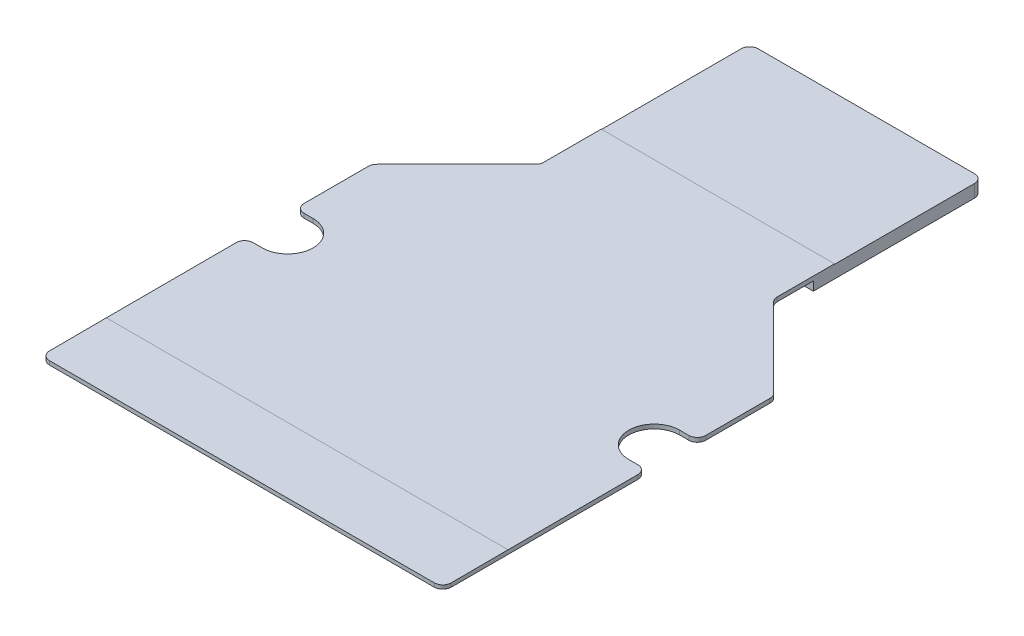
ISO-10303-21;
HEADER;
FILE_DESCRIPTION(('STEP AP214'),'2;1');
FILE_NAME('part.step','',(''),(''),'','','');
FILE_SCHEMA(('AUTOMOTIVE_DESIGN { 1 0 10303 214 1 1 1 1 }'));
ENDSEC;
DATA;
#1=APPLICATION_CONTEXT('core data for automotive mechanical design processes');
#2=APPLICATION_PROTOCOL_DEFINITION('international standard','automotive_design',2000,#1);
#3=PRODUCT_CONTEXT('',#1,'mechanical');
#4=PRODUCT('Part','Part','',(#3));
#5=PRODUCT_RELATED_PRODUCT_CATEGORY('part','',(#4));
#6=PRODUCT_DEFINITION_FORMATION('','',#4);
#7=PRODUCT_DEFINITION_CONTEXT('part definition',#1,'design');
#8=PRODUCT_DEFINITION('design','',#6,#7);
#9=PRODUCT_DEFINITION_SHAPE('','',#8);
#10=(LENGTH_UNIT() NAMED_UNIT(*) SI_UNIT(.MILLI.,.METRE.));
#11=(NAMED_UNIT(*) PLANE_ANGLE_UNIT() SI_UNIT($,.RADIAN.));
#12=(NAMED_UNIT(*) SI_UNIT($,.STERADIAN.) SOLID_ANGLE_UNIT());
#13=UNCERTAINTY_MEASURE_WITH_UNIT(LENGTH_MEASURE(1.E-05),#10,'distance_accuracy_value','');
#14=(GEOMETRIC_REPRESENTATION_CONTEXT(3) GLOBAL_UNCERTAINTY_ASSIGNED_CONTEXT((#13)) GLOBAL_UNIT_ASSIGNED_CONTEXT((#10,
#11,#12)) REPRESENTATION_CONTEXT('',''));
#15=CARTESIAN_POINT('',(0.,0.,0.));
#16=DIRECTION('',(0.,0.,1.));
#17=DIRECTION('',(1.,0.,0.));
#18=AXIS2_PLACEMENT_3D('',#15,#16,#17);
#19=CARTESIAN_POINT('',(-3.3,0.09,-3.51));
#20=DIRECTION('',(0.,-1.,0.));
#21=DIRECTION('',(0.,0.,-1.));
#22=AXIS2_PLACEMENT_3D('',#19,#20,#21);
#23=PLANE('',#22);
#24=CARTESIAN_POINT('',(-2.55,0.0900000000001455,-7.16));
#25=DIRECTION('',(0.,-1.,0.));
#26=DIRECTION('',(-1.,0.,0.));
#27=AXIS2_PLACEMENT_3D('',#24,#25,#26);
#28=CIRCLE('',#27,0.2);
#29=CARTESIAN_POINT('',(-2.75,0.0900000000000364,-7.16));
#30=VERTEX_POINT('',#29);
#31=CARTESIAN_POINT('',(-2.55,0.0900000000000728,-7.36));
#32=VERTEX_POINT('',#31);
#33=EDGE_CURVE('E668',#30,#32,#28,.T.);
#34=ORIENTED_EDGE('',*,*,#33,.F.);
#35=DIRECTION('',(0.,0.,1.));
#36=VECTOR('',#35,1.);
#37=CARTESIAN_POINT('',(-2.75,0.09,-7.62521572875));
#38=LINE('',#37,#36);
#39=CARTESIAN_POINT('',(-2.75,0.09,-3.86));
#40=VERTEX_POINT('',#39);
#41=EDGE_CURVE('E505',#40,#30,#38,.F.);
#42=ORIENTED_EDGE('',*,*,#41,.F.);
#43=DIRECTION('',(1.,0.,0.));
#44=VECTOR('',#43,1.);
#45=CARTESIAN_POINT('',(-3.3,0.09,-3.86));
#46=LINE('',#45,#44);
#47=CARTESIAN_POINT('',(2.75,0.09,-3.86));
#48=VERTEX_POINT('',#47);
#49=EDGE_CURVE('E691',#40,#48,#46,.T.);
#50=ORIENTED_EDGE('',*,*,#49,.T.);
#51=DIRECTION('',(0.,0.,1.));
#52=VECTOR('',#51,1.);
#53=CARTESIAN_POINT('',(2.75,0.09,-7.62521572875));
#54=LINE('',#53,#52);
#55=CARTESIAN_POINT('',(2.75,0.0900000000000728,-7.16));
#56=VERTEX_POINT('',#55);
#57=EDGE_CURVE('E546',#48,#56,#54,.F.);
#58=ORIENTED_EDGE('',*,*,#57,.T.);
#59=CARTESIAN_POINT('',(2.55,0.0900000000001455,-7.16));
#60=DIRECTION('',(0.,-1.,0.));
#61=DIRECTION('',(0.,0.,-1.));
#62=AXIS2_PLACEMENT_3D('',#59,#60,#61);
#63=CIRCLE('',#62,0.2);
#64=CARTESIAN_POINT('',(2.55,0.0900000000000364,-7.36));
#65=VERTEX_POINT('',#64);
#66=EDGE_CURVE('E553',#65,#56,#63,.T.);
#67=ORIENTED_EDGE('',*,*,#66,.F.);
#68=DIRECTION('',(-1.,0.,0.));
#69=VECTOR('',#68,1.);
#70=CARTESIAN_POINT('',(3.06,0.09,-7.36));
#71=LINE('',#70,#69);
#72=EDGE_CURVE('E587',#32,#65,#71,.F.);
#73=ORIENTED_EDGE('',*,*,#72,.F.);
#74=EDGE_LOOP('',(#34,#42,#50,#58,#67,#73));
#75=FACE_BOUND('',#74,.T.);
#76=ADVANCED_FACE('F17',(#75),#23,.F.);
#77=CARTESIAN_POINT('',(2.75,-0.241000000005,-7.62521572875));
#78=DIRECTION('',(-1.,0.,0.));
#79=DIRECTION('',(0.,0.,1.));
#80=AXIS2_PLACEMENT_3D('',#77,#78,#79);
#81=PLANE('',#80);
#82=DIRECTION('',(0.,1.,0.));
#83=VECTOR('',#82,1.);
#84=CARTESIAN_POINT('',(2.75,201000.,-7.16));
#85=LINE('',#84,#83);
#86=CARTESIAN_POINT('',(2.75,-0.209999999990696,-7.16));
#87=VERTEX_POINT('',#86);
#88=EDGE_CURVE('E580',#56,#87,#85,.F.);
#89=ORIENTED_EDGE('',*,*,#88,.F.);
#90=ORIENTED_EDGE('',*,*,#57,.F.);
#91=DIRECTION('',(0.,1.,0.));
#92=VECTOR('',#91,1.);
#93=CARTESIAN_POINT('',(2.75,0.0889999999956,-3.86));
#94=LINE('',#93,#92);
#95=CARTESIAN_POINT('',(2.75,0.100000000003,-3.86));
#96=VERTEX_POINT('',#95);
#97=EDGE_CURVE('E509',#48,#96,#94,.T.);
#98=ORIENTED_EDGE('',*,*,#97,.T.);
#99=DIRECTION('',(0.,0.,1.));
#100=VECTOR('',#99,1.);
#101=CARTESIAN_POINT('',(2.75,0.100000000006,-7.62521572875));
#102=LINE('',#101,#100);
#103=CARTESIAN_POINT('',(2.75,0.10000000000466,-2.50784271247));
#104=VERTEX_POINT('',#103);
#105=EDGE_CURVE('E272',#104,#96,#102,.F.);
#106=ORIENTED_EDGE('',*,*,#105,.F.);
#107=DIRECTION('',(0.,1.,0.));
#108=VECTOR('',#107,1.);
#109=CARTESIAN_POINT('',(2.75,-0.241000000005,-2.50784271247));
#110=LINE('',#109,#108);
#111=CARTESIAN_POINT('',(2.75,0.,-2.50784271247));
#112=VERTEX_POINT('',#111);
#113=EDGE_CURVE('E270',#112,#104,#110,.T.);
#114=ORIENTED_EDGE('',*,*,#113,.F.);
#115=DIRECTION('',(0.,0.,1.));
#116=VECTOR('',#115,1.);
#117=CARTESIAN_POINT('',(2.75,0.,-7.62521572875));
#118=LINE('',#117,#116);
#119=CARTESIAN_POINT('',(2.75,0.,-3.36));
#120=VERTEX_POINT('',#119);
#121=EDGE_CURVE('E253',#120,#112,#118,.T.);
#122=ORIENTED_EDGE('',*,*,#121,.F.);
#123=DIRECTION('',(0.,1.,0.));
#124=VECTOR('',#123,1.);
#125=CARTESIAN_POINT('',(2.75,-0.241000000005,-3.36));
#126=LINE('',#125,#124);
#127=CARTESIAN_POINT('',(2.75,-0.21,-3.36));
#128=VERTEX_POINT('',#127);
#129=EDGE_CURVE('E243',#128,#120,#126,.T.);
#130=ORIENTED_EDGE('',*,*,#129,.F.);
#131=DIRECTION('',(0.,0.,1.));
#132=VECTOR('',#131,1.);
#133=CARTESIAN_POINT('',(2.75,-0.21,-7.76));
#134=LINE('',#133,#132);
#135=EDGE_CURVE('E440',#128,#87,#134,.F.);
#136=ORIENTED_EDGE('',*,*,#135,.T.);
#137=EDGE_LOOP('',(#89,#90,#98,#106,#114,#122,#130,#136));
#138=FACE_BOUND('',#137,.T.);
#139=ADVANCED_FACE('F268',(#138),#81,.F.);
#140=CARTESIAN_POINT('',(2.55,201000.,-7.16));
#141=DIRECTION('',(0.,1.,0.));
#142=DIRECTION('',(0.,0.,1.));
#143=AXIS2_PLACEMENT_3D('',#140,#141,#142);
#144=CYLINDRICAL_SURFACE('',#143,0.2);
#145=ORIENTED_EDGE('',*,*,#66,.T.);
#146=ORIENTED_EDGE('',*,*,#88,.T.);
#147=CARTESIAN_POINT('',(2.55,-0.209999999981392,-7.16));
#148=DIRECTION('',(0.,1.,0.));
#149=DIRECTION('',(1.,0.,0.));
#150=AXIS2_PLACEMENT_3D('',#147,#148,#149);
#151=CIRCLE('',#150,0.2);
#152=CARTESIAN_POINT('',(2.55,-0.209999999993348,-7.36));
#153=VERTEX_POINT('',#152);
#154=EDGE_CURVE('E397',#87,#153,#151,.T.);
#155=ORIENTED_EDGE('',*,*,#154,.T.);
#156=DIRECTION('',(0.,1.,0.));
#157=VECTOR('',#156,1.);
#158=CARTESIAN_POINT('',(2.55,-0.240000000012,-7.36));
#159=LINE('',#158,#157);
#160=EDGE_CURVE('E708',#65,#153,#159,.F.);
#161=ORIENTED_EDGE('',*,*,#160,.F.);
#162=EDGE_LOOP('',(#145,#146,#155,#161));
#163=FACE_BOUND('',#162,.T.);
#164=ADVANCED_FACE('F565',(#163),#144,.T.);
#165=CARTESIAN_POINT('',(3.06,-0.240000000012,-7.36));
#166=DIRECTION('',(0.,0.,-1.));
#167=DIRECTION('',(-1.,0.,0.));
#168=AXIS2_PLACEMENT_3D('',#165,#166,#167);
#169=PLANE('',#168);
#170=ORIENTED_EDGE('',*,*,#72,.T.);
#171=ORIENTED_EDGE('',*,*,#160,.T.);
#172=DIRECTION('',(1.,0.,0.));
#173=VECTOR('',#172,1.);
#174=CARTESIAN_POINT('',(-3.3,-0.21,-7.36));
#175=LINE('',#174,#173);
#176=CARTESIAN_POINT('',(-2.55,-0.210000000000022,-7.36));
#177=VERTEX_POINT('',#176);
#178=EDGE_CURVE('E436',#153,#177,#175,.F.);
#179=ORIENTED_EDGE('',*,*,#178,.T.);
#180=DIRECTION('',(0.,-1.,0.));
#181=VECTOR('',#180,1.);
#182=CARTESIAN_POINT('',(-2.55,1000.,-7.36));
#183=LINE('',#182,#181);
#184=EDGE_CURVE('E523',#32,#177,#183,.T.);
#185=ORIENTED_EDGE('',*,*,#184,.F.);
#186=EDGE_LOOP('',(#170,#171,#179,#185));
#187=FACE_BOUND('',#186,.T.);
#188=ADVANCED_FACE('F536',(#187),#169,.T.);
#189=CARTESIAN_POINT('',(-2.55,1000.,-7.16));
#190=DIRECTION('',(0.,-1.,0.));
#191=DIRECTION('',(0.,0.,-1.));
#192=AXIS2_PLACEMENT_3D('',#189,#190,#191);
#193=CYLINDRICAL_SURFACE('',#192,0.2);
#194=ORIENTED_EDGE('',*,*,#33,.T.);
#195=ORIENTED_EDGE('',*,*,#184,.T.);
#196=CARTESIAN_POINT('',(-2.55,-0.210000000000043,-7.16));
#197=DIRECTION('',(0.,1.,0.));
#198=DIRECTION('',(0.,0.,-1.));
#199=AXIS2_PLACEMENT_3D('',#196,#197,#198);
#200=CIRCLE('',#199,0.2);
#201=CARTESIAN_POINT('',(-2.75,-0.210000000000011,-7.16));
#202=VERTEX_POINT('',#201);
#203=EDGE_CURVE('E433',#177,#202,#200,.T.);
#204=ORIENTED_EDGE('',*,*,#203,.T.);
#205=DIRECTION('',(0.,1.,0.));
#206=VECTOR('',#205,1.);
#207=CARTESIAN_POINT('',(-2.75,-0.241000000024,-7.16));
#208=LINE('',#207,#206);
#209=EDGE_CURVE('E496',#30,#202,#208,.F.);
#210=ORIENTED_EDGE('',*,*,#209,.F.);
#211=EDGE_LOOP('',(#194,#195,#204,#210));
#212=FACE_BOUND('',#211,.T.);
#213=ADVANCED_FACE('F525',(#212),#193,.T.);
#214=CARTESIAN_POINT('',(-2.75,-0.241000000024,-7.62521572875));
#215=DIRECTION('',(-1.,0.,0.));
#216=DIRECTION('',(0.,0.,1.));
#217=AXIS2_PLACEMENT_3D('',#214,#215,#216);
#218=PLANE('',#217);
#219=DIRECTION('',(0.,0.,1.));
#220=VECTOR('',#219,1.);
#221=CARTESIAN_POINT('',(-2.75,-0.21,-7.76));
#222=LINE('',#221,#220);
#223=CARTESIAN_POINT('',(-2.75,-0.21,-3.36));
#224=VERTEX_POINT('',#223);
#225=EDGE_CURVE('E424',#202,#224,#222,.T.);
#226=ORIENTED_EDGE('',*,*,#225,.T.);
#227=DIRECTION('',(0.,1.,0.));
#228=VECTOR('',#227,1.);
#229=CARTESIAN_POINT('',(-2.75,-0.241000000024,-3.36));
#230=LINE('',#229,#228);
#231=CARTESIAN_POINT('',(-2.75,0.,-3.36));
#232=VERTEX_POINT('',#231);
#233=EDGE_CURVE('E504',#224,#232,#230,.T.);
#234=ORIENTED_EDGE('',*,*,#233,.T.);
#235=DIRECTION('',(0.,0.,1.));
#236=VECTOR('',#235,1.);
#237=CARTESIAN_POINT('',(-2.75,0.,-7.62521572875));
#238=LINE('',#237,#236);
#239=CARTESIAN_POINT('',(-2.75,0.,-2.50784271247));
#240=VERTEX_POINT('',#239);
#241=EDGE_CURVE('E262',#232,#240,#238,.T.);
#242=ORIENTED_EDGE('',*,*,#241,.T.);
#243=DIRECTION('',(0.,1.,0.));
#244=VECTOR('',#243,1.);
#245=CARTESIAN_POINT('',(-2.75,-0.241000000024,-2.50784271247));
#246=LINE('',#245,#244);
#247=CARTESIAN_POINT('',(-2.75,0.0999999999999945,-2.50784271247));
#248=VERTEX_POINT('',#247);
#249=EDGE_CURVE('E680',#240,#248,#246,.T.);
#250=ORIENTED_EDGE('',*,*,#249,.T.);
#251=DIRECTION('',(0.,0.,1.));
#252=VECTOR('',#251,1.);
#253=CARTESIAN_POINT('',(-2.75,0.1,-7.62521572875));
#254=LINE('',#253,#252);
#255=CARTESIAN_POINT('',(-2.75,0.1,-3.86));
#256=VERTEX_POINT('',#255);
#257=EDGE_CURVE('E685',#248,#256,#254,.F.);
#258=ORIENTED_EDGE('',*,*,#257,.T.);
#259=DIRECTION('',(0.,1.,0.));
#260=VECTOR('',#259,1.);
#261=CARTESIAN_POINT('',(-2.75,0.0889999999956,-3.86));
#262=LINE('',#261,#260);
#263=EDGE_CURVE('E688',#256,#40,#262,.F.);
#264=ORIENTED_EDGE('',*,*,#263,.T.);
#265=ORIENTED_EDGE('',*,*,#41,.T.);
#266=ORIENTED_EDGE('',*,*,#209,.T.);
#267=EDGE_LOOP('',(#226,#234,#242,#250,#258,#264,#265,#266));
#268=FACE_BOUND('',#267,.T.);
#269=ADVANCED_FACE('F535',(#268),#218,.T.);
#270=CARTESIAN_POINT('',(-3.3,0.0889999999956,-3.86));
#271=DIRECTION('',(0.,0.,1.));
#272=DIRECTION('',(1.,0.,0.));
#273=AXIS2_PLACEMENT_3D('',#270,#271,#272);
#274=PLANE('',#273);
#275=ORIENTED_EDGE('',*,*,#263,.F.);
#276=DIRECTION('',(1.,0.,0.));
#277=VECTOR('',#276,1.);
#278=CARTESIAN_POINT('',(-5.682,0.1,-3.86));
#279=LINE('',#278,#277);
#280=EDGE_CURVE('E432',#256,#96,#279,.T.);
#281=ORIENTED_EDGE('',*,*,#280,.T.);
#282=ORIENTED_EDGE('',*,*,#97,.F.);
#283=ORIENTED_EDGE('',*,*,#49,.F.);
#284=EDGE_LOOP('',(#275,#281,#282,#283));
#285=FACE_BOUND('',#284,.T.);
#286=ADVANCED_FACE('F723',(#285),#274,.F.);
#287=CARTESIAN_POINT('',(-5.682,0.09,7.514));
#288=DIRECTION('',(0.,-1.,0.));
#289=DIRECTION('',(0.,0.,-1.));
#290=AXIS2_PLACEMENT_3D('',#287,#288,#289);
#291=PLANE('',#290);
#292=CARTESIAN_POINT('',(-4.535,0.0900000000000345,7.16));
#293=DIRECTION('',(0.,-1.,0.));
#294=DIRECTION('',(0.,0.,1.));
#295=AXIS2_PLACEMENT_3D('',#292,#293,#294);
#296=CIRCLE('',#295,0.2);
#297=CARTESIAN_POINT('',(-4.535,0.0900000000000172,7.36));
#298=VERTEX_POINT('',#297);
#299=CARTESIAN_POINT('',(-4.735,0.0900000000000086,7.16));
#300=VERTEX_POINT('',#299);
#301=EDGE_CURVE('E469',#298,#300,#296,.T.);
#302=ORIENTED_EDGE('',*,*,#301,.F.);
#303=DIRECTION('',(1.,0.,0.));
#304=VECTOR('',#303,1.);
#305=CARTESIAN_POINT('',(-5.442,0.09,7.36));
#306=LINE('',#305,#304);
#307=CARTESIAN_POINT('',(4.535,0.0900000000000172,7.36));
#308=VERTEX_POINT('',#307);
#309=EDGE_CURVE('E364',#308,#298,#306,.F.);
#310=ORIENTED_EDGE('',*,*,#309,.F.);
#311=CARTESIAN_POINT('',(4.535,0.0900000000000345,7.16));
#312=DIRECTION('',(0.,-1.,0.));
#313=DIRECTION('',(1.,0.,0.));
#314=AXIS2_PLACEMENT_3D('',#311,#312,#313);
#315=CIRCLE('',#314,0.2);
#316=CARTESIAN_POINT('',(4.735,0.0900000000000138,7.16));
#317=VERTEX_POINT('',#316);
#318=EDGE_CURVE('E459',#317,#308,#315,.T.);
#319=ORIENTED_EDGE('',*,*,#318,.F.);
#320=CARTESIAN_POINT('',(4.735,0.09,5.82));
#321=DIRECTION('',(0.,0.,1.));
#322=VECTOR('',#321,1.);
#323=LINE('',#320,#322);
#324=CARTESIAN_POINT('',(4.735,0.095,5.81999999999897));
#325=VERTEX_POINT('',#324);
#326=EDGE_CURVE('E639',#325,#317,#323,.T.);
#327=ORIENTED_EDGE('',*,*,#326,.F.);
#328=CARTESIAN_POINT('',(4.735,0.09,5.82));
#329=DIRECTION('',(-1.,0.,0.));
#330=VECTOR('',#329,1.);
#331=LINE('',#328,#330);
#332=CARTESIAN_POINT('',(-4.735,0.0950000000000325,5.81999999999005));
#333=VERTEX_POINT('',#332);
#334=EDGE_CURVE('E375',#325,#333,#331,.T.);
#335=ORIENTED_EDGE('',*,*,#334,.T.);
#336=DIRECTION('',(0.,0.,-1.));
#337=VECTOR('',#336,1.);
#338=CARTESIAN_POINT('',(-4.735,0.09,7.514));
#339=LINE('',#338,#337);
#340=EDGE_CURVE('E187',#300,#333,#339,.T.);
#341=ORIENTED_EDGE('',*,*,#340,.F.);
#342=EDGE_LOOP('',(#302,#310,#319,#327,#335,#341));
#343=FACE_BOUND('',#342,.T.);
#344=ADVANCED_FACE('F415',(#343),#291,.F.);
#345=CARTESIAN_POINT('',(-3.3,-0.21,-7.76));
#346=DIRECTION('',(0.,1.,0.));
#347=DIRECTION('',(0.,0.,1.));
#348=AXIS2_PLACEMENT_3D('',#345,#346,#347);
#349=PLANE('',#348);
#350=ORIENTED_EDGE('',*,*,#203,.F.);
#351=ORIENTED_EDGE('',*,*,#178,.F.);
#352=ORIENTED_EDGE('',*,*,#154,.F.);
#353=ORIENTED_EDGE('',*,*,#135,.F.);
#354=DIRECTION('',(1.,0.,0.));
#355=VECTOR('',#354,1.);
#356=CARTESIAN_POINT('',(-3.3,-0.21,-3.36));
#357=LINE('',#356,#355);
#358=EDGE_CURVE('E249',#224,#128,#357,.T.);
#359=ORIENTED_EDGE('',*,*,#358,.F.);
#360=ORIENTED_EDGE('',*,*,#225,.F.);
#361=EDGE_LOOP('',(#350,#351,#352,#353,#359,#360));
#362=FACE_BOUND('',#361,.T.);
#363=ADVANCED_FACE('F404',(#362),#349,.F.);
#364=CARTESIAN_POINT('',(-5.682,0.1,6.788));
#365=DIRECTION('',(0.,-1.,0.));
#366=DIRECTION('',(0.,0.,-1.));
#367=AXIS2_PLACEMENT_3D('',#364,#365,#366);
#368=PLANE('',#367);
#369=CARTESIAN_POINT('',(-4.535,0.099999999999989,2.76));
#370=DIRECTION('',(0.,1.,0.));
#371=DIRECTION('',(0.,0.,1.));
#372=AXIS2_PLACEMENT_3D('',#369,#370,#371);
#373=CIRCLE('',#372,0.2);
#374=CARTESIAN_POINT('',(-4.735,0.0999999999999917,2.76));
#375=VERTEX_POINT('',#374);
#376=CARTESIAN_POINT('',(-4.535,0.0999999999999945,2.56));
#377=VERTEX_POINT('',#376);
#378=EDGE_CURVE('E175',#375,#377,#373,.F.);
#379=ORIENTED_EDGE('',*,*,#378,.F.);
#380=DIRECTION('',(0.,0.,-1.));
#381=VECTOR('',#380,1.);
#382=CARTESIAN_POINT('',(-4.735,0.1,6.788));
#383=LINE('',#382,#381);
#384=EDGE_CURVE('E358',#333,#375,#383,.T.);
#385=ORIENTED_EDGE('',*,*,#384,.F.);
#386=ORIENTED_EDGE('',*,*,#334,.F.);
#387=DIRECTION('',(0.,0.,-1.));
#388=VECTOR('',#387,1.);
#389=CARTESIAN_POINT('',(4.735,0.1,7.6));
#390=LINE('',#389,#388);
#391=CARTESIAN_POINT('',(4.735,0.10000000000166,2.76));
#392=VERTEX_POINT('',#391);
#393=EDGE_CURVE('E378',#392,#325,#390,.F.);
#394=ORIENTED_EDGE('',*,*,#393,.F.);
#395=CARTESIAN_POINT('',(4.535,0.10000000000332,2.76));
#396=DIRECTION('',(0.,-1.,0.));
#397=DIRECTION('',(0.,0.,-1.));
#398=AXIS2_PLACEMENT_3D('',#395,#396,#397);
#399=CIRCLE('',#398,0.2);
#400=CARTESIAN_POINT('',(4.535,0.10000000000249,2.56));
#401=VERTEX_POINT('',#400);
#402=EDGE_CURVE('E319',#401,#392,#399,.T.);
#403=ORIENTED_EDGE('',*,*,#402,.F.);
#404=DIRECTION('',(1.,0.,0.));
#405=VECTOR('',#404,1.);
#406=CARTESIAN_POINT('',(4.2985,0.1,2.56));
#407=LINE('',#406,#405);
#408=CARTESIAN_POINT('',(4.32,0.10000000000166,2.56));
#409=VERTEX_POINT('',#408);
#410=EDGE_CURVE('E322',#401,#409,#407,.F.);
#411=ORIENTED_EDGE('',*,*,#410,.T.);
#412=CARTESIAN_POINT('',(4.32,0.10000000000332,1.96));
#413=DIRECTION('',(0.,-1.,0.));
#414=DIRECTION('',(0.,0.,-1.));
#415=AXIS2_PLACEMENT_3D('',#412,#413,#414);
#416=CIRCLE('',#415,0.6);
#417=CARTESIAN_POINT('',(4.32,0.10000000000249,1.36));
#418=VERTEX_POINT('',#417);
#419=EDGE_CURVE('E323',#409,#418,#416,.T.);
#420=ORIENTED_EDGE('',*,*,#419,.T.);
#421=DIRECTION('',(-1.,0.,0.));
#422=VECTOR('',#421,1.);
#423=CARTESIAN_POINT('',(4.5565,0.1,1.36));
#424=LINE('',#423,#422);
#425=CARTESIAN_POINT('',(4.535,0.10000000000166,1.36));
#426=VERTEX_POINT('',#425);
#427=EDGE_CURVE('E330',#418,#426,#424,.F.);
#428=ORIENTED_EDGE('',*,*,#427,.T.);
#429=CARTESIAN_POINT('',(4.535,0.10000000000332,1.16));
#430=DIRECTION('',(0.,1.,0.));
#431=DIRECTION('',(0.,0.,1.));
#432=AXIS2_PLACEMENT_3D('',#429,#430,#431);
#433=CIRCLE('',#432,0.2);
#434=CARTESIAN_POINT('',(4.735,0.10000000000249,1.16));
#435=VERTEX_POINT('',#434);
#436=EDGE_CURVE('E327',#435,#426,#433,.F.);
#437=ORIENTED_EDGE('',*,*,#436,.F.);
#438=DIRECTION('',(0.,0.,-1.));
#439=VECTOR('',#438,1.);
#440=CARTESIAN_POINT('',(4.735,0.1,1.31171572875));
#441=LINE('',#440,#439);
#442=CARTESIAN_POINT('',(4.735,0.100000000001493,-0.357157287525));
#443=VERTEX_POINT('',#442);
#444=EDGE_CURVE('E389',#443,#435,#441,.F.);
#445=ORIENTED_EDGE('',*,*,#444,.F.);
#446=CARTESIAN_POINT('',(4.535,0.100000000002987,-0.357157287525));
#447=DIRECTION('',(0.,-1.,0.));
#448=DIRECTION('',(0.,0.,-1.));
#449=AXIS2_PLACEMENT_3D('',#446,#447,#448);
#450=CIRCLE('',#449,0.2);
#451=CARTESIAN_POINT('',(4.67642135623608,0.100000000004489,-0.498578643760078));
#452=VERTEX_POINT('',#451);
#453=EDGE_CURVE('E332',#452,#443,#450,.T.);
#454=ORIENTED_EDGE('',*,*,#453,.F.);
#455=DIRECTION('',(-0.707106781186548,0.,-0.707106781186548));
#456=VECTOR('',#455,1.);
#457=CARTESIAN_POINT('',(4.86320562748,0.100000000006,-0.311794372515));
#458=LINE('',#457,#456);
#459=CARTESIAN_POINT('',(2.80857864376,0.10000000000466,-2.366421356235));
#460=VERTEX_POINT('',#459);
#461=EDGE_CURVE('E391',#460,#452,#458,.F.);
#462=ORIENTED_EDGE('',*,*,#461,.F.);
#463=CARTESIAN_POINT('',(2.95,0.10000000000332,-2.50784271247));
#464=DIRECTION('',(0.,1.,0.));
#465=DIRECTION('',(0.,0.,1.));
#466=AXIS2_PLACEMENT_3D('',#463,#464,#465);
#467=CIRCLE('',#466,0.2);
#468=EDGE_CURVE('E336',#460,#104,#467,.F.);
#469=ORIENTED_EDGE('',*,*,#468,.T.);
#470=ORIENTED_EDGE('',*,*,#105,.T.);
#471=ORIENTED_EDGE('',*,*,#280,.F.);
#472=ORIENTED_EDGE('',*,*,#257,.F.);
#473=CARTESIAN_POINT('',(-2.95,0.099999999999989,-2.50784271247));
#474=DIRECTION('',(0.,1.,0.));
#475=DIRECTION('',(0.,0.,1.));
#476=AXIS2_PLACEMENT_3D('',#473,#474,#475);
#477=CIRCLE('',#476,0.2);
#478=CARTESIAN_POINT('',(-2.8085786437601,0.099999999999989,-2.3664213562351));
#479=VERTEX_POINT('',#478);
#480=EDGE_CURVE('E340',#248,#479,#477,.F.);
#481=ORIENTED_EDGE('',*,*,#480,.T.);
#482=DIRECTION('',(0.707106781186548,0.,-0.707106781186548));
#483=VECTOR('',#482,1.);
#484=CARTESIAN_POINT('',(-4.86320562748,0.1,-0.311794372515));
#485=LINE('',#484,#483);
#486=CARTESIAN_POINT('',(-4.6764213562355,0.0999999999999945,-0.4985786437595));
#487=VERTEX_POINT('',#486);
#488=EDGE_CURVE('E444',#479,#487,#485,.F.);
#489=ORIENTED_EDGE('',*,*,#488,.T.);
#490=CARTESIAN_POINT('',(-4.535,0.099999999999989,-0.357157287525));
#491=DIRECTION('',(0.,-1.,0.));
#492=DIRECTION('',(0.,0.,-1.));
#493=AXIS2_PLACEMENT_3D('',#490,#491,#492);
#494=CIRCLE('',#493,0.2);
#495=CARTESIAN_POINT('',(-4.735,0.0999999999999917,-0.357157287525));
#496=VERTEX_POINT('',#495);
#497=EDGE_CURVE('E344',#496,#487,#494,.T.);
#498=ORIENTED_EDGE('',*,*,#497,.F.);
#499=DIRECTION('',(0.,0.,1.));
#500=VECTOR('',#499,1.);
#501=CARTESIAN_POINT('',(-4.735,0.1,-0.508873016278));
#502=LINE('',#501,#500);
#503=CARTESIAN_POINT('',(-4.735,0.0999999999999945,1.16));
#504=VERTEX_POINT('',#503);
#505=EDGE_CURVE('E348',#504,#496,#502,.F.);
#506=ORIENTED_EDGE('',*,*,#505,.F.);
#507=CARTESIAN_POINT('',(-4.535,0.099999999999989,1.16));
#508=DIRECTION('',(0.,-1.,0.));
#509=DIRECTION('',(0.,0.,-1.));
#510=AXIS2_PLACEMENT_3D('',#507,#508,#509);
#511=CIRCLE('',#510,0.2);
#512=CARTESIAN_POINT('',(-4.535,0.0999999999999917,1.36));
#513=VERTEX_POINT('',#512);
#514=EDGE_CURVE('E349',#513,#504,#511,.T.);
#515=ORIENTED_EDGE('',*,*,#514,.F.);
#516=DIRECTION('',(1.,0.,0.));
#517=VECTOR('',#516,1.);
#518=CARTESIAN_POINT('',(-4.5565,0.1,1.36));
#519=LINE('',#518,#517);
#520=CARTESIAN_POINT('',(-4.32,0.10000000000166,1.36));
#521=VERTEX_POINT('',#520);
#522=EDGE_CURVE('E449',#521,#513,#519,.F.);
#523=ORIENTED_EDGE('',*,*,#522,.F.);
#524=CARTESIAN_POINT('',(-4.32,0.10000000000332,1.96));
#525=DIRECTION('',(0.,-1.,0.));
#526=DIRECTION('',(0.,0.,-1.));
#527=AXIS2_PLACEMENT_3D('',#524,#525,#526);
#528=CIRCLE('',#527,0.6);
#529=CARTESIAN_POINT('',(-4.32,0.10000000000249,2.56));
#530=VERTEX_POINT('',#529);
#531=EDGE_CURVE('E353',#521,#530,#528,.T.);
#532=ORIENTED_EDGE('',*,*,#531,.T.);
#533=DIRECTION('',(-1.,0.,0.));
#534=VECTOR('',#533,1.);
#535=CARTESIAN_POINT('',(-4.2985,0.1,2.56));
#536=LINE('',#535,#534);
#537=EDGE_CURVE('E356',#377,#530,#536,.F.);
#538=ORIENTED_EDGE('',*,*,#537,.F.);
#539=EDGE_LOOP('',(#379,#385,#386,#394,#403,#411,#420,#428,#437,#445,#454,#462,#469,#470,#471,
#472,#481,#489,#498,#506,#515,#523,#532,#538));
#540=FACE_BOUND('',#539,.T.);
#541=ADVANCED_FACE('F414',(#540),#368,.F.);
#542=CARTESIAN_POINT('',(-5.442,-0.009,7.36));
#543=DIRECTION('',(0.,0.,1.));
#544=DIRECTION('',(1.,0.,0.));
#545=AXIS2_PLACEMENT_3D('',#542,#543,#544);
#546=PLANE('',#545);
#547=DIRECTION('',(1.,0.,0.));
#548=VECTOR('',#547,1.);
#549=CARTESIAN_POINT('',(-5.682,0.,7.36));
#550=LINE('',#549,#548);
#551=CARTESIAN_POINT('',(4.535,0.,7.36));
#552=VERTEX_POINT('',#551);
#553=CARTESIAN_POINT('',(-4.535,0.,7.36));
#554=VERTEX_POINT('',#553);
#555=EDGE_CURVE('E318',#552,#554,#550,.F.);
#556=ORIENTED_EDGE('',*,*,#555,.F.);
#557=DIRECTION('',(0.,1.,0.));
#558=VECTOR('',#557,1.);
#559=CARTESIAN_POINT('',(4.535,1000.,7.36));
#560=LINE('',#559,#558);
#561=EDGE_CURVE('E381',#308,#552,#560,.F.);
#562=ORIENTED_EDGE('',*,*,#561,.F.);
#563=ORIENTED_EDGE('',*,*,#309,.T.);
#564=DIRECTION('',(0.,1.,0.));
#565=VECTOR('',#564,1.);
#566=CARTESIAN_POINT('',(-4.535,1000.,7.36));
#567=LINE('',#566,#565);
#568=EDGE_CURVE('E360',#554,#298,#567,.T.);
#569=ORIENTED_EDGE('',*,*,#568,.F.);
#570=EDGE_LOOP('',(#556,#562,#563,#569));
#571=FACE_BOUND('',#570,.T.);
#572=ADVANCED_FACE('F609',(#571),#546,.T.);
#573=CARTESIAN_POINT('',(-4.535,1000.,7.16));
#574=DIRECTION('',(0.,1.,0.));
#575=DIRECTION('',(0.,0.,1.));
#576=AXIS2_PLACEMENT_3D('',#573,#574,#575);
#577=CYLINDRICAL_SURFACE('',#576,0.2);
#578=CARTESIAN_POINT('',(-4.535,0.,7.16));
#579=DIRECTION('',(0.,1.,0.));
#580=DIRECTION('',(0.,0.,1.));
#581=AXIS2_PLACEMENT_3D('',#578,#579,#580);
#582=CIRCLE('',#581,0.2);
#583=CARTESIAN_POINT('',(-4.735,0.,7.16));
#584=VERTEX_POINT('',#583);
#585=EDGE_CURVE('E315',#554,#584,#582,.F.);
#586=ORIENTED_EDGE('',*,*,#585,.F.);
#587=ORIENTED_EDGE('',*,*,#568,.T.);
#588=ORIENTED_EDGE('',*,*,#301,.T.);
#589=DIRECTION('',(0.,1.,0.));
#590=VECTOR('',#589,1.);
#591=CARTESIAN_POINT('',(-4.735,-0.01,7.16));
#592=LINE('',#591,#590);
#593=EDGE_CURVE('E359',#584,#300,#592,.T.);
#594=ORIENTED_EDGE('',*,*,#593,.F.);
#595=EDGE_LOOP('',(#586,#587,#588,#594));
#596=FACE_BOUND('',#595,.T.);
#597=ADVANCED_FACE('F599',(#596),#577,.T.);
#598=CARTESIAN_POINT('',(-4.735,-0.01,2.32));
#599=DIRECTION('',(-1.,0.,0.));
#600=DIRECTION('',(0.,0.,1.));
#601=AXIS2_PLACEMENT_3D('',#598,#599,#600);
#602=PLANE('',#601);
#603=ORIENTED_EDGE('',*,*,#384,.T.);
#604=DIRECTION('',(0.,1.,0.));
#605=VECTOR('',#604,1.);
#606=CARTESIAN_POINT('',(-4.735,1000.,2.76));
#607=LINE('',#606,#605);
#608=CARTESIAN_POINT('',(-4.735,0.,2.76));
#609=VERTEX_POINT('',#608);
#610=EDGE_CURVE('E357',#609,#375,#607,.T.);
#611=ORIENTED_EDGE('',*,*,#610,.F.);
#612=DIRECTION('',(0.,0.,-1.));
#613=VECTOR('',#612,1.);
#614=CARTESIAN_POINT('',(-4.735,0.,8.432));
#615=LINE('',#614,#613);
#616=EDGE_CURVE('E314',#584,#609,#615,.T.);
#617=ORIENTED_EDGE('',*,*,#616,.F.);
#618=ORIENTED_EDGE('',*,*,#593,.T.);
#619=ORIENTED_EDGE('',*,*,#340,.T.);
#620=EDGE_LOOP('',(#603,#611,#617,#618,#619));
#621=FACE_BOUND('',#620,.T.);
#622=ADVANCED_FACE('F608',(#621),#602,.T.);
#623=CARTESIAN_POINT('',(-4.535,1000.,2.76));
#624=DIRECTION('',(0.,1.,0.));
#625=DIRECTION('',(0.,0.,1.));
#626=AXIS2_PLACEMENT_3D('',#623,#624,#625);
#627=CYLINDRICAL_SURFACE('',#626,0.2);
#628=CARTESIAN_POINT('',(-4.535,0.,2.76));
#629=DIRECTION('',(0.,1.,0.));
#630=DIRECTION('',(0.,0.,1.));
#631=AXIS2_PLACEMENT_3D('',#628,#629,#630);
#632=CIRCLE('',#631,0.2);
#633=CARTESIAN_POINT('',(-4.535,0.,2.56));
#634=VERTEX_POINT('',#633);
#635=EDGE_CURVE('E311',#609,#634,#632,.F.);
#636=ORIENTED_EDGE('',*,*,#635,.F.);
#637=ORIENTED_EDGE('',*,*,#610,.T.);
#638=ORIENTED_EDGE('',*,*,#378,.T.);
#639=DIRECTION('',(0.,1.,0.));
#640=VECTOR('',#639,1.);
#641=CARTESIAN_POINT('',(-4.535,-0.0100000000006,2.56));
#642=LINE('',#641,#640);
#643=EDGE_CURVE('E454',#634,#377,#642,.T.);
#644=ORIENTED_EDGE('',*,*,#643,.F.);
#645=EDGE_LOOP('',(#636,#637,#638,#644));
#646=FACE_BOUND('',#645,.T.);
#647=ADVANCED_FACE('F787',(#646),#627,.T.);
#648=CARTESIAN_POINT('',(-4.2985,-0.0100000000006,2.56));
#649=DIRECTION('',(0.,0.,-1.));
#650=DIRECTION('',(-1.,0.,0.));
#651=AXIS2_PLACEMENT_3D('',#648,#649,#650);
#652=PLANE('',#651);
#653=ORIENTED_EDGE('',*,*,#537,.T.);
#654=DIRECTION('',(0.,-1.,0.));
#655=VECTOR('',#654,1.);
#656=CARTESIAN_POINT('',(-4.32,201000.,2.56));
#657=LINE('',#656,#655);
#658=CARTESIAN_POINT('',(-4.32,0.,2.56));
#659=VERTEX_POINT('',#658);
#660=EDGE_CURVE('E355',#530,#659,#657,.T.);
#661=ORIENTED_EDGE('',*,*,#660,.T.);
#662=DIRECTION('',(1.,0.,0.));
#663=VECTOR('',#662,1.);
#664=CARTESIAN_POINT('',(-5.682,0.,2.56));
#665=LINE('',#664,#663);
#666=EDGE_CURVE('E310',#634,#659,#665,.T.);
#667=ORIENTED_EDGE('',*,*,#666,.F.);
#668=ORIENTED_EDGE('',*,*,#643,.T.);
#669=EDGE_LOOP('',(#653,#661,#667,#668));
#670=FACE_BOUND('',#669,.T.);
#671=ADVANCED_FACE('F910',(#670),#652,.T.);
#672=CARTESIAN_POINT('',(-4.32,201000.,1.96));
#673=DIRECTION('',(0.,-1.,0.));
#674=DIRECTION('',(0.,0.,-1.));
#675=AXIS2_PLACEMENT_3D('',#672,#673,#674);
#676=CYLINDRICAL_SURFACE('',#675,0.6);
#677=ORIENTED_EDGE('',*,*,#531,.F.);
#678=DIRECTION('',(0.,1.,0.));
#679=VECTOR('',#678,1.);
#680=CARTESIAN_POINT('',(-4.32,-0.0100000000006,1.36));
#681=LINE('',#680,#679);
#682=CARTESIAN_POINT('',(-4.32,0.,1.36));
#683=VERTEX_POINT('',#682);
#684=EDGE_CURVE('E451',#683,#521,#681,.T.);
#685=ORIENTED_EDGE('',*,*,#684,.F.);
#686=CARTESIAN_POINT('',(-4.32,0.,1.96));
#687=DIRECTION('',(0.,-1.,0.));
#688=DIRECTION('',(0.,0.,-1.));
#689=AXIS2_PLACEMENT_3D('',#686,#687,#688);
#690=CIRCLE('',#689,0.6);
#691=EDGE_CURVE('E307',#659,#683,#690,.F.);
#692=ORIENTED_EDGE('',*,*,#691,.F.);
#693=ORIENTED_EDGE('',*,*,#660,.F.);
#694=EDGE_LOOP('',(#677,#685,#692,#693));
#695=FACE_BOUND('',#694,.T.);
#696=ADVANCED_FACE('F919',(#695),#676,.F.);
#697=CARTESIAN_POINT('',(-4.5565,-0.0100000000006,1.36));
#698=DIRECTION('',(0.,0.,1.));
#699=DIRECTION('',(1.,0.,0.));
#700=AXIS2_PLACEMENT_3D('',#697,#698,#699);
#701=PLANE('',#700);
#702=DIRECTION('',(1.,0.,0.));
#703=VECTOR('',#702,1.);
#704=CARTESIAN_POINT('',(-5.682,0.,1.36));
#705=LINE('',#704,#703);
#706=CARTESIAN_POINT('',(-4.535,0.,1.36));
#707=VERTEX_POINT('',#706);
#708=EDGE_CURVE('E306',#683,#707,#705,.F.);
#709=ORIENTED_EDGE('',*,*,#708,.F.);
#710=ORIENTED_EDGE('',*,*,#684,.T.);
#711=ORIENTED_EDGE('',*,*,#522,.T.);
#712=DIRECTION('',(0.,-1.,0.));
#713=VECTOR('',#712,1.);
#714=CARTESIAN_POINT('',(-4.535,1000.,1.36));
#715=LINE('',#714,#713);
#716=EDGE_CURVE('E352',#707,#513,#715,.F.);
#717=ORIENTED_EDGE('',*,*,#716,.F.);
#718=EDGE_LOOP('',(#709,#710,#711,#717));
#719=FACE_BOUND('',#718,.T.);
#720=ADVANCED_FACE('F929',(#719),#701,.T.);
#721=CARTESIAN_POINT('',(-4.535,1000.,1.16));
#722=DIRECTION('',(0.,-1.,0.));
#723=DIRECTION('',(0.,0.,-1.));
#724=AXIS2_PLACEMENT_3D('',#721,#722,#723);
#725=CYLINDRICAL_SURFACE('',#724,0.2);
#726=ORIENTED_EDGE('',*,*,#514,.T.);
#727=DIRECTION('',(0.,1.,0.));
#728=VECTOR('',#727,1.);
#729=CARTESIAN_POINT('',(-4.735,-0.01,1.16));
#730=LINE('',#729,#728);
#731=CARTESIAN_POINT('',(-4.735,0.,1.16));
#732=VERTEX_POINT('',#731);
#733=EDGE_CURVE('E351',#732,#504,#730,.T.);
#734=ORIENTED_EDGE('',*,*,#733,.F.);
#735=CARTESIAN_POINT('',(-4.535,0.,1.16));
#736=DIRECTION('',(0.,-1.,0.));
#737=DIRECTION('',(0.,0.,-1.));
#738=AXIS2_PLACEMENT_3D('',#735,#736,#737);
#739=CIRCLE('',#738,0.2);
#740=EDGE_CURVE('E303',#707,#732,#739,.T.);
#741=ORIENTED_EDGE('',*,*,#740,.F.);
#742=ORIENTED_EDGE('',*,*,#716,.T.);
#743=EDGE_LOOP('',(#726,#734,#741,#742));
#744=FACE_BOUND('',#743,.T.);
#745=ADVANCED_FACE('F940',(#744),#725,.T.);
#746=CARTESIAN_POINT('',(-4.735,-0.01,-0.508873016278));
#747=DIRECTION('',(-1.,0.,0.));
#748=DIRECTION('',(0.,0.,1.));
#749=AXIS2_PLACEMENT_3D('',#746,#747,#748);
#750=PLANE('',#749);
#751=ORIENTED_EDGE('',*,*,#505,.T.);
#752=DIRECTION('',(0.,-1.,0.));
#753=VECTOR('',#752,1.);
#754=CARTESIAN_POINT('',(-4.735,1000.,-0.357157287525));
#755=LINE('',#754,#753);
#756=CARTESIAN_POINT('',(-4.735,0.,-0.357157287525));
#757=VERTEX_POINT('',#756);
#758=EDGE_CURVE('E347',#757,#496,#755,.F.);
#759=ORIENTED_EDGE('',*,*,#758,.F.);
#760=DIRECTION('',(0.,0.,-1.));
#761=VECTOR('',#760,1.);
#762=CARTESIAN_POINT('',(-4.735,0.,8.432));
#763=LINE('',#762,#761);
#764=EDGE_CURVE('E302',#732,#757,#763,.T.);
#765=ORIENTED_EDGE('',*,*,#764,.F.);
#766=ORIENTED_EDGE('',*,*,#733,.T.);
#767=EDGE_LOOP('',(#751,#759,#765,#766));
#768=FACE_BOUND('',#767,.T.);
#769=ADVANCED_FACE('F951',(#768),#750,.T.);
#770=CARTESIAN_POINT('',(-4.535,1000.,-0.357157287525));
#771=DIRECTION('',(0.,-1.,0.));
#772=DIRECTION('',(0.,0.,-1.));
#773=AXIS2_PLACEMENT_3D('',#770,#771,#772);
#774=CYLINDRICAL_SURFACE('',#773,0.2);
#775=CARTESIAN_POINT('',(-4.535,0.,-0.357157287525));
#776=DIRECTION('',(0.,-1.,0.));
#777=DIRECTION('',(0.,0.,-1.));
#778=AXIS2_PLACEMENT_3D('',#775,#776,#777);
#779=CIRCLE('',#778,0.2);
#780=CARTESIAN_POINT('',(-4.67642135623744,0.,-0.498578643761557));
#781=VERTEX_POINT('',#780);
#782=EDGE_CURVE('E299',#757,#781,#779,.T.);
#783=ORIENTED_EDGE('',*,*,#782,.F.);
#784=ORIENTED_EDGE('',*,*,#758,.T.);
#785=ORIENTED_EDGE('',*,*,#497,.T.);
#786=DIRECTION('',(0.,1.,0.));
#787=VECTOR('',#786,1.);
#788=CARTESIAN_POINT('',(-4.676421356236,-0.01,-0.498578643759));
#789=LINE('',#788,#787);
#790=EDGE_CURVE('E446',#487,#781,#789,.F.);
#791=ORIENTED_EDGE('',*,*,#790,.T.);
#792=EDGE_LOOP('',(#783,#784,#785,#791));
#793=FACE_BOUND('',#792,.T.);
#794=ADVANCED_FACE('F962',(#793),#774,.T.);
#795=CARTESIAN_POINT('',(-4.86320562748,-0.01,-0.311794372515));
#796=DIRECTION('',(0.707106781186548,0.,0.707106781186548));
#797=DIRECTION('',(0.707106781186548,0.,-0.707106781186548));
#798=AXIS2_PLACEMENT_3D('',#795,#796,#797);
#799=PLANE('',#798);
#800=ORIENTED_EDGE('',*,*,#790,.F.);
#801=ORIENTED_EDGE('',*,*,#488,.F.);
#802=DIRECTION('',(0.,1.,0.));
#803=VECTOR('',#802,1.);
#804=CARTESIAN_POINT('',(-2.80857864375769,1000.,-2.36642135623769));
#805=LINE('',#804,#803);
#806=CARTESIAN_POINT('',(-2.8085786437614,0.,-2.36642135623629));
#807=VERTEX_POINT('',#806);
#808=EDGE_CURVE('E343',#479,#807,#805,.F.);
#809=ORIENTED_EDGE('',*,*,#808,.T.);
#810=DIRECTION('',(0.707106781187115,0.,-0.70710678118598));
#811=VECTOR('',#810,1.);
#812=CARTESIAN_POINT('',(-4.67642135624,0.,-0.498578643763001));
#813=LINE('',#812,#811);
#814=EDGE_CURVE('E298',#781,#807,#813,.T.);
#815=ORIENTED_EDGE('',*,*,#814,.F.);
#816=EDGE_LOOP('',(#800,#801,#809,#815));
#817=FACE_BOUND('',#816,.T.);
#818=ADVANCED_FACE('F973',(#817),#799,.F.);
#819=CARTESIAN_POINT('',(-2.95,1000.,-2.50784271247));
#820=DIRECTION('',(0.,1.,0.));
#821=DIRECTION('',(0.,0.,1.));
#822=AXIS2_PLACEMENT_3D('',#819,#820,#821);
#823=CYLINDRICAL_SURFACE('',#822,0.2);
#824=ORIENTED_EDGE('',*,*,#249,.F.);
#825=CARTESIAN_POINT('',(-2.95,0.,-2.50784271247));
#826=DIRECTION('',(0.,1.,0.));
#827=DIRECTION('',(0.,0.,1.));
#828=AXIS2_PLACEMENT_3D('',#825,#826,#827);
#829=CIRCLE('',#828,0.2);
#830=EDGE_CURVE('E264',#807,#240,#829,.T.);
#831=ORIENTED_EDGE('',*,*,#830,.F.);
#832=ORIENTED_EDGE('',*,*,#808,.F.);
#833=ORIENTED_EDGE('',*,*,#480,.F.);
#834=EDGE_LOOP('',(#824,#831,#832,#833));
#835=FACE_BOUND('',#834,.T.);
#836=ADVANCED_FACE('F984',(#835),#823,.F.);
#837=CARTESIAN_POINT('',(-3.3,-0.231,-3.36));
#838=DIRECTION('',(0.,0.,1.));
#839=DIRECTION('',(1.,0.,0.));
#840=AXIS2_PLACEMENT_3D('',#837,#838,#839);
#841=PLANE('',#840);
#842=ORIENTED_EDGE('',*,*,#358,.T.);
#843=ORIENTED_EDGE('',*,*,#129,.T.);
#844=DIRECTION('',(1.,0.,0.));
#845=VECTOR('',#844,1.);
#846=CARTESIAN_POINT('',(-5.682,0.,-3.36));
#847=LINE('',#846,#845);
#848=EDGE_CURVE('E246',#232,#120,#847,.T.);
#849=ORIENTED_EDGE('',*,*,#848,.F.);
#850=ORIENTED_EDGE('',*,*,#233,.F.);
#851=EDGE_LOOP('',(#842,#843,#849,#850));
#852=FACE_BOUND('',#851,.T.);
#853=ADVANCED_FACE('F245',(#852),#841,.T.);
#854=CARTESIAN_POINT('',(2.95,201000.,-2.50784271247));
#855=DIRECTION('',(0.,1.,0.));
#856=DIRECTION('',(0.,0.,1.));
#857=AXIS2_PLACEMENT_3D('',#854,#855,#856);
#858=CYLINDRICAL_SURFACE('',#857,0.2);
#859=DIRECTION('',(0.,1.,0.));
#860=VECTOR('',#859,1.);
#861=CARTESIAN_POINT('',(2.8085786437575,-0.0100000000006,-2.3664213562375));
#862=LINE('',#861,#860);
#863=CARTESIAN_POINT('',(2.80857864376131,0.,-2.36642135623619));
#864=VERTEX_POINT('',#863);
#865=EDGE_CURVE('E339',#864,#460,#862,.T.);
#866=ORIENTED_EDGE('',*,*,#865,.F.);
#867=CARTESIAN_POINT('',(2.95,0.,-2.50784271247));
#868=DIRECTION('',(0.,1.,0.));
#869=DIRECTION('',(0.,0.,1.));
#870=AXIS2_PLACEMENT_3D('',#867,#868,#869);
#871=CIRCLE('',#870,0.2);
#872=EDGE_CURVE('E263',#112,#864,#871,.T.);
#873=ORIENTED_EDGE('',*,*,#872,.F.);
#874=ORIENTED_EDGE('',*,*,#113,.T.);
#875=ORIENTED_EDGE('',*,*,#468,.F.);
#876=EDGE_LOOP('',(#866,#873,#874,#875));
#877=FACE_BOUND('',#876,.T.);
#878=ADVANCED_FACE('F730',(#877),#858,.F.);
#879=CARTESIAN_POINT('',(4.86320562748,-0.0100000000006,-0.311794372515));
#880=DIRECTION('',(0.707106781186548,0.,-0.707106781186548));
#881=DIRECTION('',(-0.707106781186548,0.,-0.707106781186548));
#882=AXIS2_PLACEMENT_3D('',#879,#880,#881);
#883=PLANE('',#882);
#884=ORIENTED_EDGE('',*,*,#461,.T.);
#885=DIRECTION('',(0.,-1.,0.));
#886=VECTOR('',#885,1.);
#887=CARTESIAN_POINT('',(4.67642135623831,1000.,-0.49857864376131));
#888=LINE('',#887,#886);
#889=CARTESIAN_POINT('',(4.6764213562386,0.,-0.498578643762712));
#890=VERTEX_POINT('',#889);
#891=EDGE_CURVE('E335',#890,#452,#888,.F.);
#892=ORIENTED_EDGE('',*,*,#891,.F.);
#893=DIRECTION('',(0.707106781187115,0.,0.70710678118598));
#894=VECTOR('',#893,1.);
#895=CARTESIAN_POINT('',(2.80857864376,0.,-2.36642135624));
#896=LINE('',#895,#894);
#897=EDGE_CURVE('E295',#864,#890,#896,.T.);
#898=ORIENTED_EDGE('',*,*,#897,.F.);
#899=ORIENTED_EDGE('',*,*,#865,.T.);
#900=EDGE_LOOP('',(#884,#892,#898,#899));
#901=FACE_BOUND('',#900,.T.);
#902=ADVANCED_FACE('F1014',(#901),#883,.T.);
#903=CARTESIAN_POINT('',(4.535,1000.,-0.357157287525));
#904=DIRECTION('',(0.,-1.,0.));
#905=DIRECTION('',(0.,0.,-1.));
#906=AXIS2_PLACEMENT_3D('',#903,#904,#905);
#907=CYLINDRICAL_SURFACE('',#906,0.2);
#908=ORIENTED_EDGE('',*,*,#453,.T.);
#909=DIRECTION('',(0.,1.,0.));
#910=VECTOR('',#909,1.);
#911=CARTESIAN_POINT('',(4.735,-0.01,-0.357157287525));
#912=LINE('',#911,#910);
#913=CARTESIAN_POINT('',(4.735,0.,-0.357157287525));
#914=VERTEX_POINT('',#913);
#915=EDGE_CURVE('E334',#914,#443,#912,.T.);
#916=ORIENTED_EDGE('',*,*,#915,.F.);
#917=CARTESIAN_POINT('',(4.535,0.,-0.357157287525));
#918=DIRECTION('',(0.,-1.,0.));
#919=DIRECTION('',(0.,0.,-1.));
#920=AXIS2_PLACEMENT_3D('',#917,#918,#919);
#921=CIRCLE('',#920,0.2);
#922=EDGE_CURVE('E292',#890,#914,#921,.T.);
#923=ORIENTED_EDGE('',*,*,#922,.F.);
#924=ORIENTED_EDGE('',*,*,#891,.T.);
#925=EDGE_LOOP('',(#908,#916,#923,#924));
#926=FACE_BOUND('',#925,.T.);
#927=ADVANCED_FACE('F1024',(#926),#907,.T.);
#928=CARTESIAN_POINT('',(4.735,-0.01,1.31171572875));
#929=DIRECTION('',(1.,0.,0.));
#930=DIRECTION('',(0.,0.,-1.));
#931=AXIS2_PLACEMENT_3D('',#928,#929,#930);
#932=PLANE('',#931);
#933=ORIENTED_EDGE('',*,*,#444,.T.);
#934=DIRECTION('',(0.,1.,0.));
#935=VECTOR('',#934,1.);
#936=CARTESIAN_POINT('',(4.735,201000.,1.16));
#937=LINE('',#936,#935);
#938=CARTESIAN_POINT('',(4.735,0.,1.16));
#939=VERTEX_POINT('',#938);
#940=EDGE_CURVE('E331',#939,#435,#937,.T.);
#941=ORIENTED_EDGE('',*,*,#940,.F.);
#942=DIRECTION('',(0.,0.,-1.));
#943=VECTOR('',#942,1.);
#944=CARTESIAN_POINT('',(4.735,0.,8.432));
#945=LINE('',#944,#943);
#946=EDGE_CURVE('E291',#914,#939,#945,.F.);
#947=ORIENTED_EDGE('',*,*,#946,.F.);
#948=ORIENTED_EDGE('',*,*,#915,.T.);
#949=EDGE_LOOP('',(#933,#941,#947,#948));
#950=FACE_BOUND('',#949,.T.);
#951=ADVANCED_FACE('F1034',(#950),#932,.T.);
#952=CARTESIAN_POINT('',(4.535,201000.,1.16));
#953=DIRECTION('',(0.,1.,0.));
#954=DIRECTION('',(0.,0.,1.));
#955=AXIS2_PLACEMENT_3D('',#952,#953,#954);
#956=CYLINDRICAL_SURFACE('',#955,0.2);
#957=ORIENTED_EDGE('',*,*,#436,.T.);
#958=DIRECTION('',(0.,1.,0.));
#959=VECTOR('',#958,1.);
#960=CARTESIAN_POINT('',(4.535,-0.0100000000003,1.36));
#961=LINE('',#960,#959);
#962=CARTESIAN_POINT('',(4.535,0.,1.36));
#963=VERTEX_POINT('',#962);
#964=EDGE_CURVE('E326',#426,#963,#961,.F.);
#965=ORIENTED_EDGE('',*,*,#964,.T.);
#966=CARTESIAN_POINT('',(4.535,0.,1.16));
#967=DIRECTION('',(0.,1.,0.));
#968=DIRECTION('',(0.,0.,1.));
#969=AXIS2_PLACEMENT_3D('',#966,#967,#968);
#970=CIRCLE('',#969,0.2);
#971=EDGE_CURVE('E288',#939,#963,#970,.F.);
#972=ORIENTED_EDGE('',*,*,#971,.F.);
#973=ORIENTED_EDGE('',*,*,#940,.T.);
#974=EDGE_LOOP('',(#957,#965,#972,#973));
#975=FACE_BOUND('',#974,.T.);
#976=ADVANCED_FACE('F1045',(#975),#956,.T.);
#977=CARTESIAN_POINT('',(4.5565,-0.0100000000003,1.36));
#978=DIRECTION('',(0.,0.,-1.));
#979=DIRECTION('',(-1.,0.,0.));
#980=AXIS2_PLACEMENT_3D('',#977,#978,#979);
#981=PLANE('',#980);
#982=ORIENTED_EDGE('',*,*,#964,.F.);
#983=ORIENTED_EDGE('',*,*,#427,.F.);
#984=DIRECTION('',(0.,-1.,0.));
#985=VECTOR('',#984,1.);
#986=CARTESIAN_POINT('',(4.32,201000.,1.36));
#987=LINE('',#986,#985);
#988=CARTESIAN_POINT('',(4.32,0.,1.36));
#989=VERTEX_POINT('',#988);
#990=EDGE_CURVE('E325',#418,#989,#987,.T.);
#991=ORIENTED_EDGE('',*,*,#990,.T.);
#992=DIRECTION('',(1.,0.,0.));
#993=VECTOR('',#992,1.);
#994=CARTESIAN_POINT('',(-5.682,0.,1.36));
#995=LINE('',#994,#993);
#996=EDGE_CURVE('E287',#963,#989,#995,.F.);
#997=ORIENTED_EDGE('',*,*,#996,.F.);
#998=EDGE_LOOP('',(#982,#983,#991,#997));
#999=FACE_BOUND('',#998,.T.);
#1000=ADVANCED_FACE('F1056',(#999),#981,.F.);
#1001=CARTESIAN_POINT('',(4.32,201000.,1.96));
#1002=DIRECTION('',(0.,-1.,0.));
#1003=DIRECTION('',(0.,0.,-1.));
#1004=AXIS2_PLACEMENT_3D('',#1001,#1002,#1003);
#1005=CYLINDRICAL_SURFACE('',#1004,0.6);
#1006=CARTESIAN_POINT('',(4.32,0.,1.96));
#1007=DIRECTION('',(0.,-1.,0.));
#1008=DIRECTION('',(0.,0.,-1.));
#1009=AXIS2_PLACEMENT_3D('',#1006,#1007,#1008);
#1010=CIRCLE('',#1009,0.6);
#1011=CARTESIAN_POINT('',(4.32,0.,2.56));
#1012=VERTEX_POINT('',#1011);
#1013=EDGE_CURVE('E284',#989,#1012,#1010,.F.);
#1014=ORIENTED_EDGE('',*,*,#1013,.F.);
#1015=ORIENTED_EDGE('',*,*,#990,.F.);
#1016=ORIENTED_EDGE('',*,*,#419,.F.);
#1017=DIRECTION('',(0.,1.,0.));
#1018=VECTOR('',#1017,1.);
#1019=CARTESIAN_POINT('',(4.32,-0.0100000000003,2.56));
#1020=LINE('',#1019,#1018);
#1021=EDGE_CURVE('E387',#409,#1012,#1020,.F.);
#1022=ORIENTED_EDGE('',*,*,#1021,.T.);
#1023=EDGE_LOOP('',(#1014,#1015,#1016,#1022));
#1024=FACE_BOUND('',#1023,.T.);
#1025=ADVANCED_FACE('F1067',(#1024),#1005,.F.);
#1026=CARTESIAN_POINT('',(4.2985,-0.0100000000003,2.56));
#1027=DIRECTION('',(0.,0.,1.));
#1028=DIRECTION('',(1.,0.,0.));
#1029=AXIS2_PLACEMENT_3D('',#1026,#1027,#1028);
#1030=PLANE('',#1029);
#1031=DIRECTION('',(0.,-1.,0.));
#1032=VECTOR('',#1031,1.);
#1033=CARTESIAN_POINT('',(4.535,201000.,2.56));
#1034=LINE('',#1033,#1032);
#1035=CARTESIAN_POINT('',(4.535,0.,2.56));
#1036=VERTEX_POINT('',#1035);
#1037=EDGE_CURVE('E321',#1036,#401,#1034,.F.);
#1038=ORIENTED_EDGE('',*,*,#1037,.F.);
#1039=DIRECTION('',(1.,0.,0.));
#1040=VECTOR('',#1039,1.);
#1041=CARTESIAN_POINT('',(-5.682,0.,2.56));
#1042=LINE('',#1041,#1040);
#1043=EDGE_CURVE('E283',#1012,#1036,#1042,.T.);
#1044=ORIENTED_EDGE('',*,*,#1043,.F.);
#1045=ORIENTED_EDGE('',*,*,#1021,.F.);
#1046=ORIENTED_EDGE('',*,*,#410,.F.);
#1047=EDGE_LOOP('',(#1038,#1044,#1045,#1046));
#1048=FACE_BOUND('',#1047,.T.);
#1049=ADVANCED_FACE('F1078',(#1048),#1030,.F.);
#1050=CARTESIAN_POINT('',(4.535,201000.,2.76));
#1051=DIRECTION('',(0.,-1.,0.));
#1052=DIRECTION('',(0.,0.,-1.));
#1053=AXIS2_PLACEMENT_3D('',#1050,#1051,#1052);
#1054=CYLINDRICAL_SURFACE('',#1053,0.2);
#1055=CARTESIAN_POINT('',(4.535,0.,2.76));
#1056=DIRECTION('',(0.,-1.,0.));
#1057=DIRECTION('',(0.,0.,-1.));
#1058=AXIS2_PLACEMENT_3D('',#1055,#1056,#1057);
#1059=CIRCLE('',#1058,0.2);
#1060=CARTESIAN_POINT('',(4.735,0.,2.76));
#1061=VERTEX_POINT('',#1060);
#1062=EDGE_CURVE('E280',#1036,#1061,#1059,.T.);
#1063=ORIENTED_EDGE('',*,*,#1062,.F.);
#1064=ORIENTED_EDGE('',*,*,#1037,.T.);
#1065=ORIENTED_EDGE('',*,*,#402,.T.);
#1066=DIRECTION('',(0.,1.,0.));
#1067=VECTOR('',#1066,1.);
#1068=CARTESIAN_POINT('',(4.735,-0.01,2.76));
#1069=LINE('',#1068,#1067);
#1070=EDGE_CURVE('E382',#1061,#392,#1069,.T.);
#1071=ORIENTED_EDGE('',*,*,#1070,.F.);
#1072=EDGE_LOOP('',(#1063,#1064,#1065,#1071));
#1073=FACE_BOUND('',#1072,.T.);
#1074=ADVANCED_FACE('F1089',(#1073),#1054,.T.);
#1075=CARTESIAN_POINT('',(4.735,-0.01,7.6));
#1076=DIRECTION('',(1.,0.,0.));
#1077=DIRECTION('',(0.,0.,-1.));
#1078=AXIS2_PLACEMENT_3D('',#1075,#1076,#1077);
#1079=PLANE('',#1078);
#1080=ORIENTED_EDGE('',*,*,#326,.T.);
#1081=DIRECTION('',(0.,1.,0.));
#1082=VECTOR('',#1081,1.);
#1083=CARTESIAN_POINT('',(4.735,1000.,7.16));
#1084=LINE('',#1083,#1082);
#1085=CARTESIAN_POINT('',(4.735,0.,7.16));
#1086=VERTEX_POINT('',#1085);
#1087=EDGE_CURVE('E36',#1086,#317,#1084,.T.);
#1088=ORIENTED_EDGE('',*,*,#1087,.F.);
#1089=DIRECTION('',(0.,0.,-1.));
#1090=VECTOR('',#1089,1.);
#1091=CARTESIAN_POINT('',(4.735,0.,8.432));
#1092=LINE('',#1091,#1090);
#1093=EDGE_CURVE('E27',#1061,#1086,#1092,.F.);
#1094=ORIENTED_EDGE('',*,*,#1093,.F.);
#1095=ORIENTED_EDGE('',*,*,#1070,.T.);
#1096=ORIENTED_EDGE('',*,*,#393,.T.);
#1097=EDGE_LOOP('',(#1080,#1088,#1094,#1095,#1096));
#1098=FACE_BOUND('',#1097,.T.);
#1099=ADVANCED_FACE('F623',(#1098),#1079,.T.);
#1100=CARTESIAN_POINT('',(4.535,1000.,7.16));
#1101=DIRECTION('',(0.,1.,0.));
#1102=DIRECTION('',(0.,0.,1.));
#1103=AXIS2_PLACEMENT_3D('',#1100,#1101,#1102);
#1104=CYLINDRICAL_SURFACE('',#1103,0.2);
#1105=CARTESIAN_POINT('',(4.535,0.,7.16));
#1106=DIRECTION('',(0.,1.,0.));
#1107=DIRECTION('',(0.,0.,1.));
#1108=AXIS2_PLACEMENT_3D('',#1105,#1106,#1107);
#1109=CIRCLE('',#1108,0.2);
#1110=EDGE_CURVE('E11',#1086,#552,#1109,.F.);
#1111=ORIENTED_EDGE('',*,*,#1110,.F.);
#1112=ORIENTED_EDGE('',*,*,#1087,.T.);
#1113=ORIENTED_EDGE('',*,*,#318,.T.);
#1114=ORIENTED_EDGE('',*,*,#561,.T.);
#1115=EDGE_LOOP('',(#1111,#1112,#1113,#1114));
#1116=FACE_BOUND('',#1115,.T.);
#1117=ADVANCED_FACE('F618',(#1116),#1104,.T.);
#1118=CARTESIAN_POINT('',(-5.682,0.,8.432));
#1119=DIRECTION('',(0.,-1.,0.));
#1120=DIRECTION('',(0.,0.,-1.));
#1121=AXIS2_PLACEMENT_3D('',#1118,#1119,#1120);
#1122=PLANE('',#1121);
#1123=ORIENTED_EDGE('',*,*,#1093,.T.);
#1124=ORIENTED_EDGE('',*,*,#1110,.T.);
#1125=ORIENTED_EDGE('',*,*,#555,.T.);
#1126=ORIENTED_EDGE('',*,*,#585,.T.);
#1127=ORIENTED_EDGE('',*,*,#616,.T.);
#1128=ORIENTED_EDGE('',*,*,#635,.T.);
#1129=ORIENTED_EDGE('',*,*,#666,.T.);
#1130=ORIENTED_EDGE('',*,*,#691,.T.);
#1131=ORIENTED_EDGE('',*,*,#708,.T.);
#1132=ORIENTED_EDGE('',*,*,#740,.T.);
#1133=ORIENTED_EDGE('',*,*,#764,.T.);
#1134=ORIENTED_EDGE('',*,*,#782,.T.);
#1135=ORIENTED_EDGE('',*,*,#814,.T.);
#1136=ORIENTED_EDGE('',*,*,#830,.T.);
#1137=ORIENTED_EDGE('',*,*,#241,.F.);
#1138=ORIENTED_EDGE('',*,*,#848,.T.);
#1139=ORIENTED_EDGE('',*,*,#121,.T.);
#1140=ORIENTED_EDGE('',*,*,#872,.T.);
#1141=ORIENTED_EDGE('',*,*,#897,.T.);
#1142=ORIENTED_EDGE('',*,*,#922,.T.);
#1143=ORIENTED_EDGE('',*,*,#946,.T.);
#1144=ORIENTED_EDGE('',*,*,#971,.T.);
#1145=ORIENTED_EDGE('',*,*,#996,.T.);
#1146=ORIENTED_EDGE('',*,*,#1013,.T.);
#1147=ORIENTED_EDGE('',*,*,#1043,.T.);
#1148=ORIENTED_EDGE('',*,*,#1062,.T.);
#1149=EDGE_LOOP('',(#1123,#1124,#1125,#1126,#1127,#1128,#1129,#1130,#1131,#1132,#1133,#1134,
#1135,#1136,#1137,#1138,#1139,#1140,#1141,#1142,#1143,#1144,#1145,#1146,#1147,#1148));
#1150=FACE_BOUND('',#1149,.T.);
#1151=ADVANCED_FACE('F257',(#1150),#1122,.T.);
#1152=CLOSED_SHELL('',(#76,#139,#164,#188,#213,#269,#286,#344,#363,#541,#572,#597,#622,#647,
#671,#696,#720,#745,#769,#794,#818,#836,#853,#878,#902,#927,#951,#976,#1000,#1025,#1049,#1074,
#1099,#1117,#1151));
#1153=MANIFOLD_SOLID_BREP('B1',#1152);
#1154=ADVANCED_BREP_SHAPE_REPRESENTATION('',(#18,#1153),#14);
#1155=SHAPE_DEFINITION_REPRESENTATION(#9,#1154);
ENDSEC;
END-ISO-10303-21;
